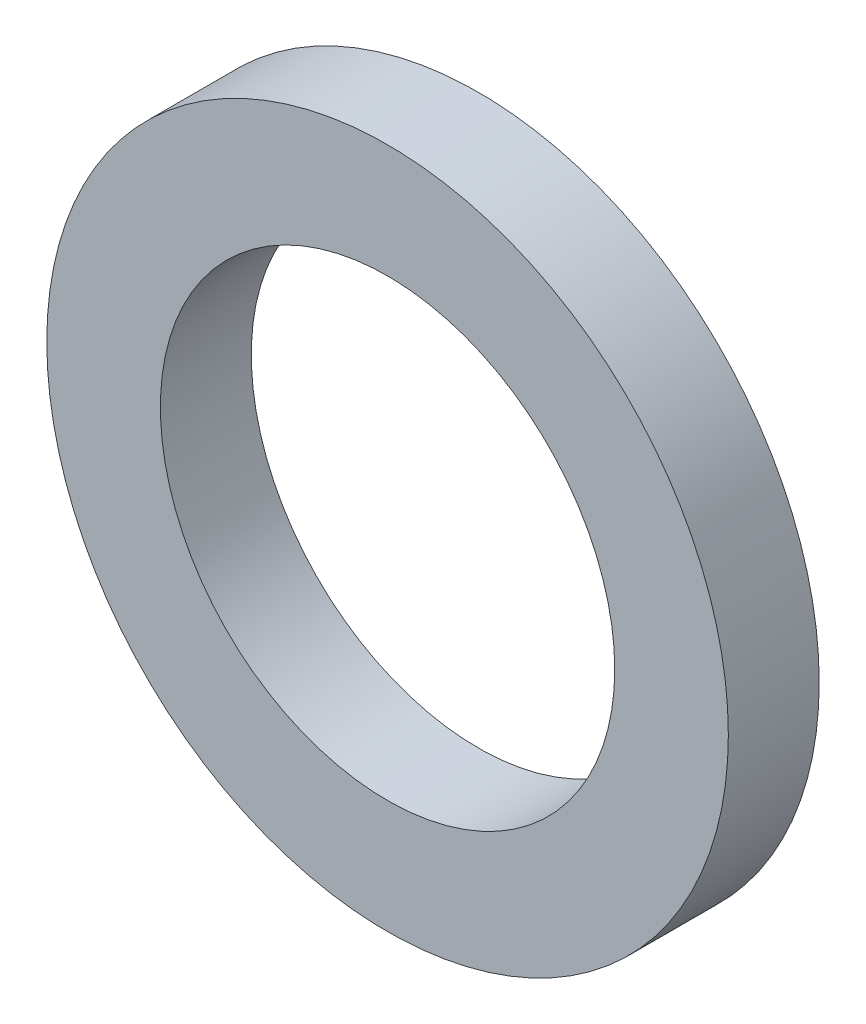
ISO-10303-21;
HEADER;
FILE_DESCRIPTION(('STEP AP214'),'2;1');
FILE_NAME('part.step','',(''),(''),'','','');
FILE_SCHEMA(('AUTOMOTIVE_DESIGN { 1 0 10303 214 1 1 1 1 }'));
ENDSEC;
DATA;
#1=APPLICATION_CONTEXT('core data for automotive mechanical design processes');
#2=APPLICATION_PROTOCOL_DEFINITION('international standard','automotive_design',2000,#1);
#3=PRODUCT_CONTEXT('',#1,'mechanical');
#4=PRODUCT('Part','Part','',(#3));
#5=PRODUCT_RELATED_PRODUCT_CATEGORY('part','',(#4));
#6=PRODUCT_DEFINITION_FORMATION('','',#4);
#7=PRODUCT_DEFINITION_CONTEXT('part definition',#1,'design');
#8=PRODUCT_DEFINITION('design','',#6,#7);
#9=PRODUCT_DEFINITION_SHAPE('','',#8);
#10=(LENGTH_UNIT() NAMED_UNIT(*) SI_UNIT(.MILLI.,.METRE.));
#11=(NAMED_UNIT(*) PLANE_ANGLE_UNIT() SI_UNIT($,.RADIAN.));
#12=(NAMED_UNIT(*) SI_UNIT($,.STERADIAN.) SOLID_ANGLE_UNIT());
#13=UNCERTAINTY_MEASURE_WITH_UNIT(LENGTH_MEASURE(1.E-05),#10,'distance_accuracy_value','');
#14=(GEOMETRIC_REPRESENTATION_CONTEXT(3) GLOBAL_UNCERTAINTY_ASSIGNED_CONTEXT((#13)) GLOBAL_UNIT_ASSIGNED_CONTEXT((#10,
#11,#12)) REPRESENTATION_CONTEXT('',''));
#15=CARTESIAN_POINT('',(0.,0.,0.));
#16=DIRECTION('',(0.,0.,1.));
#17=DIRECTION('',(1.,0.,0.));
#18=AXIS2_PLACEMENT_3D('',#15,#16,#17);
#19=CARTESIAN_POINT('',(0.,0.,2.));
#20=DIRECTION('',(0.,0.,1.));
#21=DIRECTION('',(1.,0.,0.));
#22=AXIS2_PLACEMENT_3D('',#19,#20,#21);
#23=PLANE('',#22);
#24=CARTESIAN_POINT('',(0.,0.,2.));
#25=DIRECTION('',(0.,0.,1.));
#26=DIRECTION('',(1.,0.,0.));
#27=AXIS2_PLACEMENT_3D('',#24,#25,#26);
#28=CIRCLE('',#27,7.5);
#29=CARTESIAN_POINT('',(7.5,0.,2.));
#30=VERTEX_POINT('',#29);
#31=EDGE_CURVE('E10',#30,#30,#28,.T.);
#32=ORIENTED_EDGE('',*,*,#31,.T.);
#33=EDGE_LOOP('',(#32));
#34=FACE_BOUND('',#33,.T.);
#35=CARTESIAN_POINT('',(0.,0.,2.));
#36=DIRECTION('',(0.,0.,1.));
#37=DIRECTION('',(1.,0.,0.));
#38=AXIS2_PLACEMENT_3D('',#35,#36,#37);
#39=CIRCLE('',#38,5.);
#40=CARTESIAN_POINT('',(5.,0.,2.));
#41=VERTEX_POINT('',#40);
#42=EDGE_CURVE('E50',#41,#41,#39,.T.);
#43=ORIENTED_EDGE('',*,*,#42,.F.);
#44=EDGE_LOOP('',(#43));
#45=FACE_BOUND('',#44,.T.);
#46=ADVANCED_FACE('F39',(#34,#45),#23,.T.);
#47=CARTESIAN_POINT('',(0.,0.,0.));
#48=DIRECTION('',(0.,0.,1.));
#49=DIRECTION('',(1.,0.,0.));
#50=AXIS2_PLACEMENT_3D('',#47,#48,#49);
#51=PLANE('',#50);
#52=CARTESIAN_POINT('',(0.,0.,0.));
#53=DIRECTION('',(0.,0.,1.));
#54=DIRECTION('',(1.,0.,0.));
#55=AXIS2_PLACEMENT_3D('',#52,#53,#54);
#56=CIRCLE('',#55,7.5);
#57=CARTESIAN_POINT('',(7.5,0.,0.));
#58=VERTEX_POINT('',#57);
#59=EDGE_CURVE('E43',#58,#58,#56,.T.);
#60=ORIENTED_EDGE('',*,*,#59,.F.);
#61=EDGE_LOOP('',(#60));
#62=FACE_BOUND('',#61,.T.);
#63=CARTESIAN_POINT('',(0.,0.,0.));
#64=DIRECTION('',(0.,0.,1.));
#65=DIRECTION('',(1.,0.,0.));
#66=AXIS2_PLACEMENT_3D('',#63,#64,#65);
#67=CIRCLE('',#66,5.);
#68=CARTESIAN_POINT('',(5.,0.,0.));
#69=VERTEX_POINT('',#68);
#70=EDGE_CURVE('E52',#69,#69,#67,.T.);
#71=ORIENTED_EDGE('',*,*,#70,.T.);
#72=EDGE_LOOP('',(#71));
#73=FACE_BOUND('',#72,.T.);
#74=ADVANCED_FACE('F62',(#62,#73),#51,.F.);
#75=CARTESIAN_POINT('',(0.,0.,2.));
#76=DIRECTION('',(0.,0.,-1.));
#77=DIRECTION('',(-1.,0.,0.));
#78=AXIS2_PLACEMENT_3D('',#75,#76,#77);
#79=CYLINDRICAL_SURFACE('',#78,7.5);
#80=ORIENTED_EDGE('',*,*,#31,.F.);
#81=EDGE_LOOP('',(#80));
#82=FACE_BOUND('',#81,.T.);
#83=ORIENTED_EDGE('',*,*,#59,.T.);
#84=EDGE_LOOP('',(#83));
#85=FACE_BOUND('',#84,.T.);
#86=ADVANCED_FACE('F41',(#82,#85),#79,.T.);
#87=CARTESIAN_POINT('',(0.,0.,2.));
#88=DIRECTION('',(0.,0.,-1.));
#89=DIRECTION('',(-1.,0.,0.));
#90=AXIS2_PLACEMENT_3D('',#87,#88,#89);
#91=CYLINDRICAL_SURFACE('',#90,5.);
#92=ORIENTED_EDGE('',*,*,#42,.T.);
#93=EDGE_LOOP('',(#92));
#94=FACE_BOUND('',#93,.T.);
#95=ORIENTED_EDGE('',*,*,#70,.F.);
#96=EDGE_LOOP('',(#95));
#97=FACE_BOUND('',#96,.T.);
#98=ADVANCED_FACE('F58',(#94,#97),#91,.F.);
#99=CLOSED_SHELL('',(#46,#74,#86,#98));
#100=MANIFOLD_SOLID_BREP('B2',#99);
#101=ADVANCED_BREP_SHAPE_REPRESENTATION('',(#18,#100),#14);
#102=SHAPE_DEFINITION_REPRESENTATION(#9,#101);
ENDSEC;
END-ISO-10303-21;
